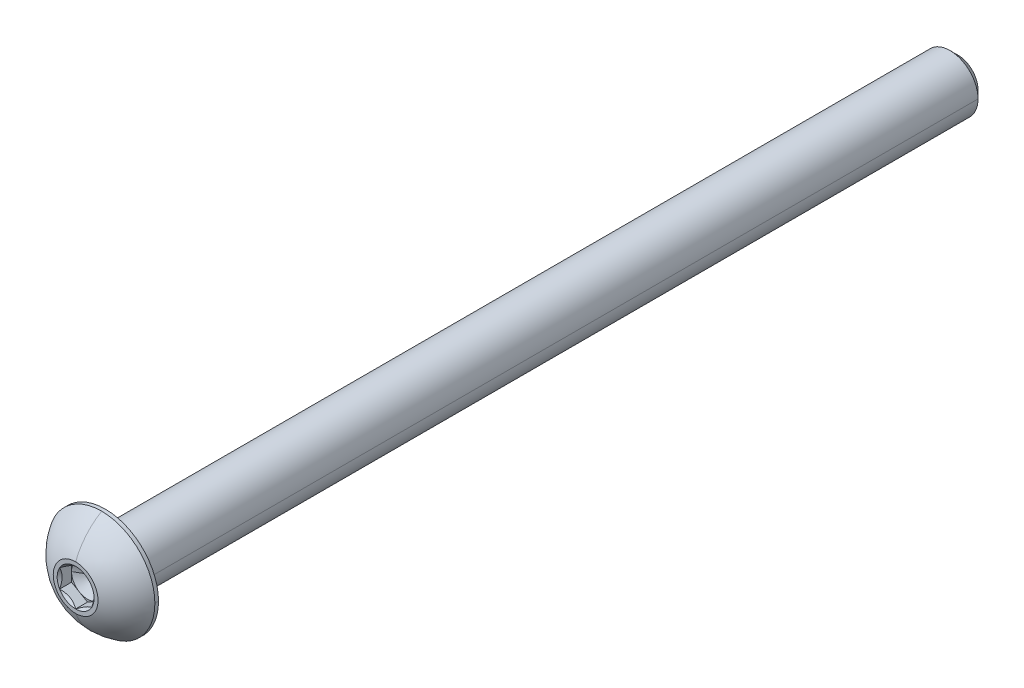
ISO-10303-21;
HEADER;
FILE_DESCRIPTION(('STEP AP214'),'2;1');
FILE_NAME('part.step','',(''),(''),'','','');
FILE_SCHEMA(('AUTOMOTIVE_DESIGN { 1 0 10303 214 1 1 1 1 }'));
ENDSEC;
DATA;
#1=APPLICATION_CONTEXT('core data for automotive mechanical design processes');
#2=APPLICATION_PROTOCOL_DEFINITION('international standard','automotive_design',2000,#1);
#3=PRODUCT_CONTEXT('',#1,'mechanical');
#4=PRODUCT('Part','Part','',(#3));
#5=PRODUCT_RELATED_PRODUCT_CATEGORY('part','',(#4));
#6=PRODUCT_DEFINITION_FORMATION('','',#4);
#7=PRODUCT_DEFINITION_CONTEXT('part definition',#1,'design');
#8=PRODUCT_DEFINITION('design','',#6,#7);
#9=PRODUCT_DEFINITION_SHAPE('','',#8);
#10=(LENGTH_UNIT() NAMED_UNIT(*) SI_UNIT(.MILLI.,.METRE.));
#11=(NAMED_UNIT(*) PLANE_ANGLE_UNIT() SI_UNIT($,.RADIAN.));
#12=(NAMED_UNIT(*) SI_UNIT($,.STERADIAN.) SOLID_ANGLE_UNIT());
#13=UNCERTAINTY_MEASURE_WITH_UNIT(LENGTH_MEASURE(1.E-05),#10,'distance_accuracy_value','');
#14=(GEOMETRIC_REPRESENTATION_CONTEXT(3) GLOBAL_UNCERTAINTY_ASSIGNED_CONTEXT((#13)) GLOBAL_UNIT_ASSIGNED_CONTEXT((#10,
#11,#12)) REPRESENTATION_CONTEXT('',''));
#15=CARTESIAN_POINT('',(0.,0.,0.));
#16=DIRECTION('',(0.,0.,1.));
#17=DIRECTION('',(1.,0.,0.));
#18=AXIS2_PLACEMENT_3D('',#15,#16,#17);
#19=CARTESIAN_POINT('',(0.,0.,32.8549));
#20=DIRECTION('',(0.,0.,1.));
#21=DIRECTION('',(1.,0.,0.));
#22=AXIS2_PLACEMENT_3D('',#19,#20,#21);
#23=CONICAL_SURFACE('',#22,1.3748153285078,0.78539816339745);
#24=CARTESIAN_POINT('',(0.,0.,32.8549));
#25=DIRECTION('',(0.,0.,1.));
#26=DIRECTION('',(1.,0.,0.));
#27=AXIS2_PLACEMENT_3D('',#24,#25,#26);
#28=CIRCLE('',#27,1.3748153285078);
#29=CARTESIAN_POINT('',(1.190625,0.687407664253897,32.8549));
#30=VERTEX_POINT('',#29);
#31=CARTESIAN_POINT('',(0.,1.3748153285078,32.8549));
#32=VERTEX_POINT('',#31);
#33=EDGE_CURVE('E444',#30,#32,#28,.T.);
#34=ORIENTED_EDGE('',*,*,#33,.T.);
#35=CARTESIAN_POINT('',(1.190625,0.687407664253899,32.8549));
#36=CARTESIAN_POINT('',(0.873024114796924,0.870774620820758,32.6715330434332));
#37=CARTESIAN_POINT('',(0.597505961514452,1.02984510078502,32.6707123654655));
#38=CARTESIAN_POINT('',(0.320451722064789,1.18980244051141,32.6698871120023));
#39=CARTESIAN_POINT('',(0.,1.3748153285078,32.8549));
#40=B_SPLINE_CURVE_WITH_KNOTS('',2,(#35,#36,#37,#38,#39),.UNSPECIFIED.,.F.,.F.,(3,2,3),(0.,0.5,
1.),.UNSPECIFIED.);
#41=EDGE_CURVE('E532',#30,#32,#40,.T.);
#42=ORIENTED_EDGE('',*,*,#41,.F.);
#43=EDGE_LOOP('',(#34,#42));
#44=FACE_BOUND('',#43,.T.);
#45=ADVANCED_FACE('F16',(#44),#23,.F.);
#46=CARTESIAN_POINT('',(0.,0.,32.8549));
#47=DIRECTION('',(0.,0.,1.));
#48=DIRECTION('',(1.,0.,0.));
#49=AXIS2_PLACEMENT_3D('',#46,#47,#48);
#50=CONICAL_SURFACE('',#49,1.3748153285078,0.78539816339745);
#51=DIRECTION('',(0.707106781186549,0.,0.707106781186546));
#52=VECTOR('',#51,1.);
#53=CARTESIAN_POINT('',(1.3748153285078,0.,32.8549));
#54=LINE('',#53,#52);
#55=CARTESIAN_POINT('',(1.190625,0.,32.6707096714922));
#56=VERTEX_POINT('',#55);
#57=CARTESIAN_POINT('',(1.3748153285078,0.,32.8549));
#58=VERTEX_POINT('',#57);
#59=EDGE_CURVE('E312',#56,#58,#54,.T.);
#60=ORIENTED_EDGE('',*,*,#59,.F.);
#61=CARTESIAN_POINT('',(1.190625,-0.687407664253897,32.8549));
#62=CARTESIAN_POINT('',(1.190625,-0.513285358669951,32.767838847208));
#63=CARTESIAN_POINT('',(1.190625,-0.353905765803971,32.7221946431507));
#64=CARTESIAN_POINT('',(1.190625,-0.174131487971274,32.6707096714922));
#65=CARTESIAN_POINT('',(1.190625,0.,32.6707096714922));
#66=B_SPLINE_CURVE_WITH_KNOTS('',2,(#61,#62,#63,#64,#65),.UNSPECIFIED.,.F.,.F.,(3,2,3),(0.,0.5,
1.),.UNSPECIFIED.);
#67=CARTESIAN_POINT('',(1.190625,-0.687407664253897,32.8549));
#68=VERTEX_POINT('',#67);
#69=EDGE_CURVE('E247',#68,#56,#66,.T.);
#70=ORIENTED_EDGE('',*,*,#69,.F.);
#71=CARTESIAN_POINT('',(0.,0.,32.8549));
#72=DIRECTION('',(0.,0.,1.));
#73=DIRECTION('',(1.,0.,0.));
#74=AXIS2_PLACEMENT_3D('',#71,#72,#73);
#75=CIRCLE('',#74,1.3748153285078);
#76=EDGE_CURVE('E437',#68,#58,#75,.T.);
#77=ORIENTED_EDGE('',*,*,#76,.T.);
#78=EDGE_LOOP('',(#60,#70,#77));
#79=FACE_BOUND('',#78,.T.);
#80=ADVANCED_FACE('F292',(#79),#50,.F.);
#81=CARTESIAN_POINT('',(0.,0.,32.8549));
#82=DIRECTION('',(0.,0.,1.));
#83=DIRECTION('',(1.,0.,0.));
#84=AXIS2_PLACEMENT_3D('',#81,#82,#83);
#85=CONICAL_SURFACE('',#84,1.3748153285078,0.78539816339745);
#86=CARTESIAN_POINT('',(0.,0.,32.8549));
#87=DIRECTION('',(0.,0.,1.));
#88=DIRECTION('',(1.,0.,0.));
#89=AXIS2_PLACEMENT_3D('',#86,#87,#88);
#90=CIRCLE('',#89,1.3748153285078);
#91=CARTESIAN_POINT('',(0.,-1.3748153285078,32.8549));
#92=VERTEX_POINT('',#91);
#93=EDGE_CURVE('E426',#92,#68,#90,.T.);
#94=ORIENTED_EDGE('',*,*,#93,.T.);
#95=CARTESIAN_POINT('',(0.,-1.3748153285078,32.8549));
#96=CARTESIAN_POINT('',(0.317600885191901,-1.19144837194739,32.6715330434396));
#97=CARTESIAN_POINT('',(0.593119038485549,-1.03237789197667,32.6707123654655));
#98=CARTESIAN_POINT('',(0.870173277923972,-0.872420552256772,32.6698871119958));
#99=CARTESIAN_POINT('',(1.190625,-0.687407664253898,32.8549));
#100=B_SPLINE_CURVE_WITH_KNOTS('',2,(#95,#96,#97,#98,#99),.UNSPECIFIED.,.F.,.F.,(3,2,3),(0.,0.5,
1.),.UNSPECIFIED.);
#101=EDGE_CURVE('E238',#92,#68,#100,.T.);
#102=ORIENTED_EDGE('',*,*,#101,.F.);
#103=EDGE_LOOP('',(#94,#102));
#104=FACE_BOUND('',#103,.T.);
#105=ADVANCED_FACE('F402',(#104),#85,.F.);
#106=CARTESIAN_POINT('',(0.,0.,32.8549));
#107=DIRECTION('',(0.,0.,1.));
#108=DIRECTION('',(1.,0.,0.));
#109=AXIS2_PLACEMENT_3D('',#106,#107,#108);
#110=CONICAL_SURFACE('',#109,1.3748153285078,0.78539816339745);
#111=CARTESIAN_POINT('',(0.,0.,32.8549));
#112=DIRECTION('',(0.,0.,1.));
#113=DIRECTION('',(1.,0.,0.));
#114=AXIS2_PLACEMENT_3D('',#111,#112,#113);
#115=CIRCLE('',#114,1.3748153285078);
#116=CARTESIAN_POINT('',(-1.190625,-0.6874076642539,32.8549));
#117=VERTEX_POINT('',#116);
#118=EDGE_CURVE('E424',#117,#92,#115,.T.);
#119=ORIENTED_EDGE('',*,*,#118,.T.);
#120=CARTESIAN_POINT('',(-1.190625,-0.6874076642539,32.8549));
#121=CARTESIAN_POINT('',(-0.87302411480077,-0.870774620818538,32.6715330434353));
#122=CARTESIAN_POINT('',(-0.597505961514451,-1.02984510078502,32.6707123654655));
#123=CARTESIAN_POINT('',(-0.320451722068542,-1.18980244050924,32.6698871120002));
#124=CARTESIAN_POINT('',(0.,-1.3748153285078,32.8549));
#125=B_SPLINE_CURVE_WITH_KNOTS('',2,(#120,#121,#122,#123,#124),.UNSPECIFIED.,.F.,.F.,(3,2,3),
(0.,0.5,1.),.UNSPECIFIED.);
#126=EDGE_CURVE('E383',#117,#92,#125,.T.);
#127=ORIENTED_EDGE('',*,*,#126,.F.);
#128=EDGE_LOOP('',(#119,#127));
#129=FACE_BOUND('',#128,.T.);
#130=ADVANCED_FACE('F391',(#129),#110,.F.);
#131=CARTESIAN_POINT('',(0.,0.,32.8549));
#132=DIRECTION('',(0.,0.,1.));
#133=DIRECTION('',(1.,0.,0.));
#134=AXIS2_PLACEMENT_3D('',#131,#132,#133);
#135=CONICAL_SURFACE('',#134,1.3748153285078,0.78539816339745);
#136=CARTESIAN_POINT('',(0.,0.,32.8549));
#137=DIRECTION('',(0.,0.,1.));
#138=DIRECTION('',(1.,0.,0.));
#139=AXIS2_PLACEMENT_3D('',#136,#137,#138);
#140=CIRCLE('',#139,1.3748153285078);
#141=CARTESIAN_POINT('',(-1.190625,0.687407664253897,32.8549));
#142=VERTEX_POINT('',#141);
#143=EDGE_CURVE('E261',#142,#117,#140,.T.);
#144=ORIENTED_EDGE('',*,*,#143,.T.);
#145=CARTESIAN_POINT('',(-1.190625,0.687407664253897,32.8549));
#146=CARTESIAN_POINT('',(-1.190625,0.512542074756485,32.7674672052513));
#147=CARTESIAN_POINT('',(-1.190625,0.354007376669906,32.7222235982477));
#148=CARTESIAN_POINT('',(-1.190625,0.17371570732276,32.6707708529976));
#149=CARTESIAN_POINT('',(-1.190625,-0.000136673000707003,32.6707096793366));
#150=CARTESIAN_POINT('',(-1.190625,-0.17277776285971,32.670648931894));
#151=CARTESIAN_POINT('',(-1.190625,-0.353970621561858,32.722213123607));
#152=CARTESIAN_POINT('',(-1.190625,-0.51195006134082,32.7671711985435));
#153=CARTESIAN_POINT('',(-1.190625,-0.6874076642539,32.8549));
#154=B_SPLINE_CURVE_WITH_KNOTS('',2,(#145,#146,#147,#148,#149,#150,#151,#152,#153),
.UNSPECIFIED.,.F.,.F.,(3,2,2,2,3),(0.,0.25,0.5,0.75,1.),.UNSPECIFIED.);
#155=EDGE_CURVE('E230',#142,#117,#154,.T.);
#156=ORIENTED_EDGE('',*,*,#155,.F.);
#157=EDGE_LOOP('',(#144,#156));
#158=FACE_BOUND('',#157,.T.);
#159=ADVANCED_FACE('F401',(#158),#135,.F.);
#160=CARTESIAN_POINT('',(0.,0.,32.8549));
#161=DIRECTION('',(0.,0.,1.));
#162=DIRECTION('',(1.,0.,0.));
#163=AXIS2_PLACEMENT_3D('',#160,#161,#162);
#164=CONICAL_SURFACE('',#163,1.3748153285078,0.78539816339745);
#165=CARTESIAN_POINT('',(0.,0.,32.8549));
#166=DIRECTION('',(0.,0.,1.));
#167=DIRECTION('',(1.,0.,0.));
#168=AXIS2_PLACEMENT_3D('',#165,#166,#167);
#169=CIRCLE('',#168,1.3748153285078);
#170=EDGE_CURVE('E521',#32,#142,#169,.T.);
#171=ORIENTED_EDGE('',*,*,#170,.T.);
#172=CARTESIAN_POINT('',(0.,1.3748153285078,32.8549));
#173=CARTESIAN_POINT('',(-0.317600885199246,1.19144837194315,32.6715330434353));
#174=CARTESIAN_POINT('',(-0.593119038485549,1.03237789197667,32.6707123654655));
#175=CARTESIAN_POINT('',(-0.870173277931471,0.872420552252443,32.6698871120002));
#176=CARTESIAN_POINT('',(-1.190625,0.687407664253898,32.8549));
#177=B_SPLINE_CURVE_WITH_KNOTS('',2,(#172,#173,#174,#175,#176),.UNSPECIFIED.,.F.,.F.,(3,2,3),
(0.,0.5,1.),.UNSPECIFIED.);
#178=EDGE_CURVE('E496',#32,#142,#177,.T.);
#179=ORIENTED_EDGE('',*,*,#178,.F.);
#180=EDGE_LOOP('',(#171,#179));
#181=FACE_BOUND('',#180,.T.);
#182=ADVANCED_FACE('F846',(#181),#164,.F.);
#183=CARTESIAN_POINT('',(0.,0.,31.97098));
#184=DIRECTION('',(0.,0.,1.));
#185=DIRECTION('',(1.,0.,0.));
#186=AXIS2_PLACEMENT_3D('',#183,#184,#185);
#187=CONICAL_SURFACE('',#186,1.190625,1.0471975511966);
#188=DIRECTION('',(-0.866025403784439,0.,0.5));
#189=VECTOR('',#188,1.);
#190=CARTESIAN_POINT('',(-1.190625,0.,31.97098));
#191=LINE('',#190,#189);
#192=CARTESIAN_POINT('',(0.,0.,31.2835723357461));
#193=VERTEX_POINT('',#192);
#194=CARTESIAN_POINT('',(-1.190625,0.,31.97098));
#195=VERTEX_POINT('',#194);
#196=EDGE_CURVE('E206',#193,#195,#191,.T.);
#197=ORIENTED_EDGE('',*,*,#196,.F.);
#198=DIRECTION('',(0.866025403784439,0.,0.5));
#199=VECTOR('',#198,1.);
#200=CARTESIAN_POINT('',(1.190625,0.,31.97098));
#201=LINE('',#200,#199);
#202=CARTESIAN_POINT('',(1.190625,0.,31.97098));
#203=VERTEX_POINT('',#202);
#204=EDGE_CURVE('E203',#193,#203,#201,.T.);
#205=ORIENTED_EDGE('',*,*,#204,.T.);
#206=CARTESIAN_POINT('',(0.,0.,31.97098));
#207=DIRECTION('',(0.,0.,1.));
#208=DIRECTION('',(1.,0.,0.));
#209=AXIS2_PLACEMENT_3D('',#206,#207,#208);
#210=CIRCLE('',#209,1.190625);
#211=CARTESIAN_POINT('',(0.5953125,1.03111149638085,31.97098));
#212=VERTEX_POINT('',#211);
#213=EDGE_CURVE('E11',#203,#212,#210,.T.);
#214=ORIENTED_EDGE('',*,*,#213,.T.);
#215=CARTESIAN_POINT('',(0.,0.,31.97098));
#216=DIRECTION('',(0.,0.,1.));
#217=DIRECTION('',(1.,0.,0.));
#218=AXIS2_PLACEMENT_3D('',#215,#216,#217);
#219=CIRCLE('',#218,1.190625);
#220=CARTESIAN_POINT('',(-0.5953125,1.03111149638085,31.97098));
#221=VERTEX_POINT('',#220);
#222=EDGE_CURVE('E30',#212,#221,#219,.T.);
#223=ORIENTED_EDGE('',*,*,#222,.T.);
#224=CARTESIAN_POINT('',(0.,0.,31.97098));
#225=DIRECTION('',(0.,0.,1.));
#226=DIRECTION('',(1.,0.,0.));
#227=AXIS2_PLACEMENT_3D('',#224,#225,#226);
#228=CIRCLE('',#227,1.190625);
#229=EDGE_CURVE('E65',#221,#195,#228,.T.);
#230=ORIENTED_EDGE('',*,*,#229,.T.);
#231=EDGE_LOOP('',(#197,#205,#214,#223,#230));
#232=FACE_BOUND('',#231,.T.);
#233=ADVANCED_FACE('F852',(#232),#187,.F.);
#234=CARTESIAN_POINT('',(0.,0.,31.97098));
#235=DIRECTION('',(0.,0.,1.));
#236=DIRECTION('',(1.,0.,0.));
#237=AXIS2_PLACEMENT_3D('',#234,#235,#236);
#238=PLANE('',#237);
#239=ORIENTED_EDGE('',*,*,#213,.F.);
#240=DIRECTION('',(0.,1.,0.));
#241=VECTOR('',#240,1.);
#242=CARTESIAN_POINT('',(1.190625,-0.687407664253898,31.97098));
#243=LINE('',#242,#241);
#244=CARTESIAN_POINT('',(1.190625,0.687407664253899,31.97098));
#245=VERTEX_POINT('',#244);
#246=EDGE_CURVE('E202',#203,#245,#243,.T.);
#247=ORIENTED_EDGE('',*,*,#246,.T.);
#248=DIRECTION('',(-0.866025403784439,0.5,0.));
#249=VECTOR('',#248,1.);
#250=CARTESIAN_POINT('',(1.190625,0.687407664253899,31.97098));
#251=LINE('',#250,#249);
#252=EDGE_CURVE('E267',#245,#212,#251,.T.);
#253=ORIENTED_EDGE('',*,*,#252,.T.);
#254=EDGE_LOOP('',(#239,#247,#253));
#255=FACE_BOUND('',#254,.T.);
#256=ADVANCED_FACE('F796',(#255),#238,.T.);
#257=CARTESIAN_POINT('',(0.,0.,31.97098));
#258=DIRECTION('',(0.,0.,1.));
#259=DIRECTION('',(1.,0.,0.));
#260=AXIS2_PLACEMENT_3D('',#257,#258,#259);
#261=PLANE('',#260);
#262=ORIENTED_EDGE('',*,*,#222,.F.);
#263=DIRECTION('',(-0.866025403784439,0.5,0.));
#264=VECTOR('',#263,1.);
#265=CARTESIAN_POINT('',(1.190625,0.687407664253899,31.97098));
#266=LINE('',#265,#264);
#267=CARTESIAN_POINT('',(0.,1.3748153285078,31.97098));
#268=VERTEX_POINT('',#267);
#269=EDGE_CURVE('E263',#212,#268,#266,.T.);
#270=ORIENTED_EDGE('',*,*,#269,.T.);
#271=DIRECTION('',(-0.866025403784438,-0.5,0.));
#272=VECTOR('',#271,1.);
#273=CARTESIAN_POINT('',(0.,1.3748153285078,31.97098));
#274=LINE('',#273,#272);
#275=EDGE_CURVE('E226',#268,#221,#274,.T.);
#276=ORIENTED_EDGE('',*,*,#275,.T.);
#277=EDGE_LOOP('',(#262,#270,#276));
#278=FACE_BOUND('',#277,.T.);
#279=ADVANCED_FACE('F792',(#278),#261,.T.);
#280=CARTESIAN_POINT('',(0.,0.,31.97098));
#281=DIRECTION('',(0.,0.,1.));
#282=DIRECTION('',(1.,0.,0.));
#283=AXIS2_PLACEMENT_3D('',#280,#281,#282);
#284=PLANE('',#283);
#285=ORIENTED_EDGE('',*,*,#229,.F.);
#286=DIRECTION('',(-0.866025403784438,-0.5,0.));
#287=VECTOR('',#286,1.);
#288=CARTESIAN_POINT('',(0.,1.3748153285078,31.97098));
#289=LINE('',#288,#287);
#290=CARTESIAN_POINT('',(-1.190625,0.687407664253898,31.97098));
#291=VERTEX_POINT('',#290);
#292=EDGE_CURVE('E231',#221,#291,#289,.T.);
#293=ORIENTED_EDGE('',*,*,#292,.T.);
#294=DIRECTION('',(0.,-1.,0.));
#295=VECTOR('',#294,1.);
#296=CARTESIAN_POINT('',(-1.190625,0.687407664253898,31.97098));
#297=LINE('',#296,#295);
#298=EDGE_CURVE('E469',#291,#195,#297,.T.);
#299=ORIENTED_EDGE('',*,*,#298,.T.);
#300=EDGE_LOOP('',(#285,#293,#299));
#301=FACE_BOUND('',#300,.T.);
#302=ADVANCED_FACE('F356',(#301),#284,.T.);
#303=CARTESIAN_POINT('',(0.,0.,31.97098));
#304=DIRECTION('',(0.,0.,1.));
#305=DIRECTION('',(1.,0.,0.));
#306=AXIS2_PLACEMENT_3D('',#303,#304,#305);
#307=PLANE('',#306);
#308=CARTESIAN_POINT('',(0.,0.,31.97098));
#309=DIRECTION('',(0.,0.,1.));
#310=DIRECTION('',(1.,0.,0.));
#311=AXIS2_PLACEMENT_3D('',#308,#309,#310);
#312=CIRCLE('',#311,1.190625);
#313=CARTESIAN_POINT('',(-0.5953125,-1.03111149638085,31.97098));
#314=VERTEX_POINT('',#313);
#315=EDGE_CURVE('E208',#195,#314,#312,.T.);
#316=ORIENTED_EDGE('',*,*,#315,.F.);
#317=DIRECTION('',(0.,-1.,0.));
#318=VECTOR('',#317,1.);
#319=CARTESIAN_POINT('',(-1.190625,0.687407664253898,31.97098));
#320=LINE('',#319,#318);
#321=CARTESIAN_POINT('',(-1.190625,-0.687407664253899,31.97098));
#322=VERTEX_POINT('',#321);
#323=EDGE_CURVE('E472',#195,#322,#320,.T.);
#324=ORIENTED_EDGE('',*,*,#323,.T.);
#325=DIRECTION('',(0.866025403784439,-0.5,0.));
#326=VECTOR('',#325,1.);
#327=CARTESIAN_POINT('',(-1.190625,-0.687407664253899,31.97098));
#328=LINE('',#327,#326);
#329=EDGE_CURVE('E235',#322,#314,#328,.T.);
#330=ORIENTED_EDGE('',*,*,#329,.T.);
#331=EDGE_LOOP('',(#316,#324,#330));
#332=FACE_BOUND('',#331,.T.);
#333=ADVANCED_FACE('F366',(#332),#307,.T.);
#334=CARTESIAN_POINT('',(0.,0.,31.97098));
#335=DIRECTION('',(0.,0.,1.));
#336=DIRECTION('',(1.,0.,0.));
#337=AXIS2_PLACEMENT_3D('',#334,#335,#336);
#338=PLANE('',#337);
#339=CARTESIAN_POINT('',(0.,0.,31.97098));
#340=DIRECTION('',(0.,0.,1.));
#341=DIRECTION('',(1.,0.,0.));
#342=AXIS2_PLACEMENT_3D('',#339,#340,#341);
#343=CIRCLE('',#342,1.190625);
#344=CARTESIAN_POINT('',(0.5953125,-1.03111149638085,31.97098));
#345=VERTEX_POINT('',#344);
#346=EDGE_CURVE('E198',#314,#345,#343,.T.);
#347=ORIENTED_EDGE('',*,*,#346,.F.);
#348=DIRECTION('',(0.866025403784439,-0.5,0.));
#349=VECTOR('',#348,1.);
#350=CARTESIAN_POINT('',(-1.190625,-0.687407664253899,31.97098));
#351=LINE('',#350,#349);
#352=CARTESIAN_POINT('',(0.,-1.3748153285078,31.97098));
#353=VERTEX_POINT('',#352);
#354=EDGE_CURVE('E239',#314,#353,#351,.T.);
#355=ORIENTED_EDGE('',*,*,#354,.T.);
#356=DIRECTION('',(0.866025403784439,0.5,0.));
#357=VECTOR('',#356,1.);
#358=CARTESIAN_POINT('',(0.,-1.3748153285078,31.97098));
#359=LINE('',#358,#357);
#360=EDGE_CURVE('E243',#353,#345,#359,.T.);
#361=ORIENTED_EDGE('',*,*,#360,.T.);
#362=EDGE_LOOP('',(#347,#355,#361));
#363=FACE_BOUND('',#362,.T.);
#364=ADVANCED_FACE('F290',(#363),#338,.T.);
#365=CARTESIAN_POINT('',(0.,0.,31.97098));
#366=DIRECTION('',(0.,0.,1.));
#367=DIRECTION('',(1.,0.,0.));
#368=AXIS2_PLACEMENT_3D('',#365,#366,#367);
#369=PLANE('',#368);
#370=CARTESIAN_POINT('',(0.,0.,31.97098));
#371=DIRECTION('',(0.,0.,1.));
#372=DIRECTION('',(1.,0.,0.));
#373=AXIS2_PLACEMENT_3D('',#370,#371,#372);
#374=CIRCLE('',#373,1.190625);
#375=EDGE_CURVE('E187',#345,#203,#374,.T.);
#376=ORIENTED_EDGE('',*,*,#375,.F.);
#377=DIRECTION('',(0.866025403784439,0.5,0.));
#378=VECTOR('',#377,1.);
#379=CARTESIAN_POINT('',(0.,-1.3748153285078,31.97098));
#380=LINE('',#379,#378);
#381=CARTESIAN_POINT('',(1.190625,-0.687407664253898,31.97098));
#382=VERTEX_POINT('',#381);
#383=EDGE_CURVE('E240',#345,#382,#380,.T.);
#384=ORIENTED_EDGE('',*,*,#383,.T.);
#385=DIRECTION('',(0.,1.,0.));
#386=VECTOR('',#385,1.);
#387=CARTESIAN_POINT('',(1.190625,-0.687407664253898,31.97098));
#388=LINE('',#387,#386);
#389=EDGE_CURVE('E45',#382,#203,#388,.T.);
#390=ORIENTED_EDGE('',*,*,#389,.T.);
#391=EDGE_LOOP('',(#376,#384,#390));
#392=FACE_BOUND('',#391,.T.);
#393=ADVANCED_FACE('F289',(#392),#369,.T.);
#394=CARTESIAN_POINT('',(1.190625,-0.687407664253898,32.8549));
#395=DIRECTION('',(-1.,0.,0.));
#396=DIRECTION('',(0.,1.,0.));
#397=AXIS2_PLACEMENT_3D('',#394,#395,#396);
#398=PLANE('',#397);
#399=ORIENTED_EDGE('',*,*,#69,.T.);
#400=CARTESIAN_POINT('',(1.190625,0.,32.6707096714922));
#401=CARTESIAN_POINT('',(1.190625,0.172347256927115,32.6707096714922));
#402=CARTESIAN_POINT('',(1.190625,0.354072322932422,32.7222421093766));
#403=CARTESIAN_POINT('',(1.190625,0.511214824203054,32.7668035799746));
#404=CARTESIAN_POINT('',(1.190625,0.687407664253896,32.8549));
#405=B_SPLINE_CURVE_WITH_KNOTS('',2,(#400,#401,#402,#403,#404),.UNSPECIFIED.,.F.,.F.,(3,2,3),
(0.,0.5,1.),.UNSPECIFIED.);
#406=EDGE_CURVE('E310',#56,#30,#405,.T.);
#407=ORIENTED_EDGE('',*,*,#406,.T.);
#408=DIRECTION('',(0.,0.,-1.));
#409=VECTOR('',#408,1.);
#410=CARTESIAN_POINT('',(1.190625,0.687407664253899,32.8549));
#411=LINE('',#410,#409);
#412=EDGE_CURVE('E485',#30,#245,#411,.T.);
#413=ORIENTED_EDGE('',*,*,#412,.T.);
#414=ORIENTED_EDGE('',*,*,#246,.F.);
#415=ORIENTED_EDGE('',*,*,#389,.F.);
#416=DIRECTION('',(0.,0.,-1.));
#417=VECTOR('',#416,1.);
#418=CARTESIAN_POINT('',(1.190625,-0.687407664253898,32.8549));
#419=LINE('',#418,#417);
#420=EDGE_CURVE('E244',#68,#382,#419,.T.);
#421=ORIENTED_EDGE('',*,*,#420,.F.);
#422=EDGE_LOOP('',(#399,#407,#413,#414,#415,#421));
#423=FACE_BOUND('',#422,.T.);
#424=ADVANCED_FACE('F278',(#423),#398,.T.);
#425=CARTESIAN_POINT('',(0.,-1.3748153285078,32.8549));
#426=DIRECTION('',(-0.5,0.866025403784438,0.));
#427=DIRECTION('',(0.,0.,1.));
#428=AXIS2_PLACEMENT_3D('',#425,#426,#427);
#429=PLANE('',#428);
#430=ORIENTED_EDGE('',*,*,#101,.T.);
#431=ORIENTED_EDGE('',*,*,#420,.T.);
#432=ORIENTED_EDGE('',*,*,#383,.F.);
#433=ORIENTED_EDGE('',*,*,#360,.F.);
#434=DIRECTION('',(0.,0.,-1.));
#435=VECTOR('',#434,1.);
#436=CARTESIAN_POINT('',(0.,-1.3748153285078,32.8549));
#437=LINE('',#436,#435);
#438=EDGE_CURVE('E413',#92,#353,#437,.T.);
#439=ORIENTED_EDGE('',*,*,#438,.F.);
#440=EDGE_LOOP('',(#430,#431,#432,#433,#439));
#441=FACE_BOUND('',#440,.T.);
#442=ADVANCED_FACE('F288',(#441),#429,.T.);
#443=CARTESIAN_POINT('',(-1.190625,-0.687407664253899,32.8549));
#444=DIRECTION('',(0.5,0.866025403784439,0.));
#445=DIRECTION('',(0.,0.,-1.));
#446=AXIS2_PLACEMENT_3D('',#443,#444,#445);
#447=PLANE('',#446);
#448=ORIENTED_EDGE('',*,*,#126,.T.);
#449=ORIENTED_EDGE('',*,*,#438,.T.);
#450=ORIENTED_EDGE('',*,*,#354,.F.);
#451=ORIENTED_EDGE('',*,*,#329,.F.);
#452=DIRECTION('',(0.,0.,-1.));
#453=VECTOR('',#452,1.);
#454=CARTESIAN_POINT('',(-1.190625,-0.687407664253899,32.8549));
#455=LINE('',#454,#453);
#456=EDGE_CURVE('E389',#117,#322,#455,.T.);
#457=ORIENTED_EDGE('',*,*,#456,.F.);
#458=EDGE_LOOP('',(#448,#449,#450,#451,#457));
#459=FACE_BOUND('',#458,.T.);
#460=ADVANCED_FACE('F355',(#459),#447,.T.);
#461=CARTESIAN_POINT('',(-1.190625,0.687407664253898,32.8549));
#462=DIRECTION('',(1.,0.,0.));
#463=DIRECTION('',(0.,1.,0.));
#464=AXIS2_PLACEMENT_3D('',#461,#462,#463);
#465=PLANE('',#464);
#466=ORIENTED_EDGE('',*,*,#155,.T.);
#467=ORIENTED_EDGE('',*,*,#456,.T.);
#468=ORIENTED_EDGE('',*,*,#323,.F.);
#469=ORIENTED_EDGE('',*,*,#298,.F.);
#470=DIRECTION('',(0.,0.,-1.));
#471=VECTOR('',#470,1.);
#472=CARTESIAN_POINT('',(-1.190625,0.687407664253898,32.8549));
#473=LINE('',#472,#471);
#474=EDGE_CURVE('E493',#142,#291,#473,.T.);
#475=ORIENTED_EDGE('',*,*,#474,.F.);
#476=EDGE_LOOP('',(#466,#467,#468,#469,#475));
#477=FACE_BOUND('',#476,.T.);
#478=ADVANCED_FACE('F18',(#477),#465,.T.);
#479=CARTESIAN_POINT('',(0.,1.3748153285078,32.8549));
#480=DIRECTION('',(0.5,-0.866025403784439,0.));
#481=DIRECTION('',(0.,0.,-1.));
#482=AXIS2_PLACEMENT_3D('',#479,#480,#481);
#483=PLANE('',#482);
#484=ORIENTED_EDGE('',*,*,#178,.T.);
#485=ORIENTED_EDGE('',*,*,#474,.T.);
#486=ORIENTED_EDGE('',*,*,#292,.F.);
#487=ORIENTED_EDGE('',*,*,#275,.F.);
#488=DIRECTION('',(0.,0.,-1.));
#489=VECTOR('',#488,1.);
#490=CARTESIAN_POINT('',(0.,1.3748153285078,32.8549));
#491=LINE('',#490,#489);
#492=EDGE_CURVE('E268',#32,#268,#491,.T.);
#493=ORIENTED_EDGE('',*,*,#492,.F.);
#494=EDGE_LOOP('',(#484,#485,#486,#487,#493));
#495=FACE_BOUND('',#494,.T.);
#496=ADVANCED_FACE('F763',(#495),#483,.T.);
#497=CARTESIAN_POINT('',(1.190625,0.687407664253899,32.8549));
#498=DIRECTION('',(-0.5,-0.866025403784439,0.));
#499=DIRECTION('',(-0.866025403784439,0.5,0.));
#500=AXIS2_PLACEMENT_3D('',#497,#498,#499);
#501=PLANE('',#500);
#502=ORIENTED_EDGE('',*,*,#41,.T.);
#503=ORIENTED_EDGE('',*,*,#492,.T.);
#504=ORIENTED_EDGE('',*,*,#269,.F.);
#505=ORIENTED_EDGE('',*,*,#252,.F.);
#506=ORIENTED_EDGE('',*,*,#412,.F.);
#507=EDGE_LOOP('',(#502,#503,#504,#505,#506));
#508=FACE_BOUND('',#507,.T.);
#509=ADVANCED_FACE('F754',(#508),#501,.T.);
#510=CARTESIAN_POINT('',(0.,1.4874875,-32.8549));
#511=DIRECTION('',(0.,0.,1.));
#512=DIRECTION('',(1.,0.,0.));
#513=AXIS2_PLACEMENT_3D('',#510,#511,#512);
#514=PLANE('',#513);
#515=CARTESIAN_POINT('',(0.,0.,-32.8549));
#516=DIRECTION('',(0.,0.,1.));
#517=DIRECTION('',(1.,0.,0.));
#518=AXIS2_PLACEMENT_3D('',#515,#516,#517);
#519=CIRCLE('',#518,1.4874875);
#520=CARTESIAN_POINT('',(1.4874875,0.,-32.8549));
#521=VERTEX_POINT('',#520);
#522=CARTESIAN_POINT('',(-1.4874875,0.,-32.8549));
#523=VERTEX_POINT('',#522);
#524=EDGE_CURVE('E216',#521,#523,#519,.T.);
#525=ORIENTED_EDGE('',*,*,#524,.F.);
#526=CARTESIAN_POINT('',(0.,0.,-32.8549));
#527=DIRECTION('',(0.,0.,1.));
#528=DIRECTION('',(1.,0.,0.));
#529=AXIS2_PLACEMENT_3D('',#526,#527,#528);
#530=CIRCLE('',#529,1.4874875);
#531=EDGE_CURVE('E259',#523,#521,#530,.T.);
#532=ORIENTED_EDGE('',*,*,#531,.F.);
#533=EDGE_LOOP('',(#525,#532));
#534=FACE_BOUND('',#533,.T.);
#535=ADVANCED_FACE('F736',(#534),#514,.F.);
#536=CARTESIAN_POINT('',(0.,0.,28.5515956824338));
#537=DIRECTION('',(-1.,0.,0.));
#538=DIRECTION('',(0.,1.,0.));
#539=AXIS2_PLACEMENT_3D('',#536,#537,#538);
#540=SPHERICAL_SURFACE('',#539,4.61485647828933);
#541=CARTESIAN_POINT('',(0.,0.,28.5515956824338));
#542=DIRECTION('',(-1.,0.,0.));
#543=DIRECTION('',(0.,-1.,0.));
#544=AXIS2_PLACEMENT_3D('',#541,#542,#543);
#545=CIRCLE('',#544,4.61485647828933);
#546=CARTESIAN_POINT('',(0.,-3.9624,30.9172428571428));
#547=VERTEX_POINT('',#546);
#548=CARTESIAN_POINT('',(0.,-1.666875,32.8549));
#549=VERTEX_POINT('',#548);
#550=EDGE_CURVE('E186',#547,#549,#545,.T.);
#551=ORIENTED_EDGE('',*,*,#550,.F.);
#552=CARTESIAN_POINT('',(0.,0.,30.9172428571428));
#553=DIRECTION('',(0.,0.,1.));
#554=DIRECTION('',(1.,0.,0.));
#555=AXIS2_PLACEMENT_3D('',#552,#553,#554);
#556=CIRCLE('',#555,3.9624);
#557=CARTESIAN_POINT('',(3.9624,0.,30.9172428571428));
#558=VERTEX_POINT('',#557);
#559=EDGE_CURVE('E183',#547,#558,#556,.T.);
#560=ORIENTED_EDGE('',*,*,#559,.T.);
#561=CARTESIAN_POINT('',(0.,0.,30.9172428571428));
#562=DIRECTION('',(0.,0.,1.));
#563=DIRECTION('',(1.,0.,0.));
#564=AXIS2_PLACEMENT_3D('',#561,#562,#563);
#565=CIRCLE('',#564,3.9624);
#566=CARTESIAN_POINT('',(0.,3.9624,30.9172428571428));
#567=VERTEX_POINT('',#566);
#568=EDGE_CURVE('E169',#558,#567,#565,.T.);
#569=ORIENTED_EDGE('',*,*,#568,.T.);
#570=CARTESIAN_POINT('',(0.,0.,28.5515956824338));
#571=DIRECTION('',(1.,0.,0.));
#572=DIRECTION('',(0.,0.,-1.));
#573=AXIS2_PLACEMENT_3D('',#570,#571,#572);
#574=CIRCLE('',#573,4.61485647828933);
#575=CARTESIAN_POINT('',(0.,1.666875,32.8549));
#576=VERTEX_POINT('',#575);
#577=EDGE_CURVE('E178',#567,#576,#574,.T.);
#578=ORIENTED_EDGE('',*,*,#577,.T.);
#579=CARTESIAN_POINT('',(0.,0.,32.8549));
#580=DIRECTION('',(0.,0.,1.));
#581=DIRECTION('',(1.,0.,0.));
#582=AXIS2_PLACEMENT_3D('',#579,#580,#581);
#583=CIRCLE('',#582,1.666875);
#584=EDGE_CURVE('E224',#549,#576,#583,.T.);
#585=ORIENTED_EDGE('',*,*,#584,.F.);
#586=EDGE_LOOP('',(#551,#560,#569,#578,#585));
#587=FACE_BOUND('',#586,.T.);
#588=ADVANCED_FACE('F728',(#587),#540,.T.);
#589=CARTESIAN_POINT('',(0.,0.,32.8549));
#590=DIRECTION('',(0.,0.,1.));
#591=DIRECTION('',(1.,0.,0.));
#592=AXIS2_PLACEMENT_3D('',#589,#590,#591);
#593=CYLINDRICAL_SURFACE('',#592,3.9624);
#594=DIRECTION('',(0.,0.,1.));
#595=VECTOR('',#594,1.);
#596=CARTESIAN_POINT('',(-3.9624,0.,32.8549));
#597=LINE('',#596,#595);
#598=CARTESIAN_POINT('',(-3.9624,0.,30.6451));
#599=VERTEX_POINT('',#598);
#600=CARTESIAN_POINT('',(-3.9624,0.,30.9172428571428));
#601=VERTEX_POINT('',#600);
#602=EDGE_CURVE('E156',#599,#601,#597,.T.);
#603=ORIENTED_EDGE('',*,*,#602,.F.);
#604=CARTESIAN_POINT('',(0.,0.,30.6451));
#605=DIRECTION('',(0.,0.,1.));
#606=DIRECTION('',(1.,0.,0.));
#607=AXIS2_PLACEMENT_3D('',#604,#605,#606);
#608=CIRCLE('',#607,3.9624);
#609=CARTESIAN_POINT('',(3.9624,0.,30.6451));
#610=VERTEX_POINT('',#609);
#611=EDGE_CURVE('E255',#599,#610,#608,.T.);
#612=ORIENTED_EDGE('',*,*,#611,.T.);
#613=DIRECTION('',(0.,0.,1.));
#614=VECTOR('',#613,1.);
#615=CARTESIAN_POINT('',(3.9624,0.,32.8549));
#616=LINE('',#615,#614);
#617=EDGE_CURVE('E251',#610,#558,#616,.T.);
#618=ORIENTED_EDGE('',*,*,#617,.T.);
#619=ORIENTED_EDGE('',*,*,#559,.F.);
#620=CARTESIAN_POINT('',(0.,0.,30.9172428571428));
#621=DIRECTION('',(0.,0.,1.));
#622=DIRECTION('',(1.,0.,0.));
#623=AXIS2_PLACEMENT_3D('',#620,#621,#622);
#624=CIRCLE('',#623,3.9624);
#625=EDGE_CURVE('E175',#601,#547,#624,.T.);
#626=ORIENTED_EDGE('',*,*,#625,.F.);
#627=EDGE_LOOP('',(#603,#612,#618,#619,#626));
#628=FACE_BOUND('',#627,.T.);
#629=ADVANCED_FACE('F181',(#628),#593,.T.);
#630=CARTESIAN_POINT('',(0.,3.9624,30.6451));
#631=DIRECTION('',(0.,0.,1.));
#632=DIRECTION('',(1.,0.,0.));
#633=AXIS2_PLACEMENT_3D('',#630,#631,#632);
#634=PLANE('',#633);
#635=CARTESIAN_POINT('',(0.,0.,30.6451));
#636=DIRECTION('',(0.,0.,1.));
#637=DIRECTION('',(1.,0.,0.));
#638=AXIS2_PLACEMENT_3D('',#635,#636,#637);
#639=CIRCLE('',#638,2.0828);
#640=CARTESIAN_POINT('',(2.0828,0.,30.6451));
#641=VERTEX_POINT('',#640);
#642=CARTESIAN_POINT('',(-2.0828,0.,30.6451));
#643=VERTEX_POINT('',#642);
#644=EDGE_CURVE('E217',#641,#643,#639,.T.);
#645=ORIENTED_EDGE('',*,*,#644,.T.);
#646=CARTESIAN_POINT('',(0.,0.,30.6451));
#647=DIRECTION('',(0.,0.,1.));
#648=DIRECTION('',(1.,0.,0.));
#649=AXIS2_PLACEMENT_3D('',#646,#647,#648);
#650=CIRCLE('',#649,2.0828);
#651=EDGE_CURVE('E252',#643,#641,#650,.T.);
#652=ORIENTED_EDGE('',*,*,#651,.T.);
#653=EDGE_LOOP('',(#645,#652));
#654=FACE_BOUND('',#653,.T.);
#655=CARTESIAN_POINT('',(0.,0.,30.6451));
#656=DIRECTION('',(0.,0.,1.));
#657=DIRECTION('',(1.,0.,0.));
#658=AXIS2_PLACEMENT_3D('',#655,#656,#657);
#659=CIRCLE('',#658,3.9624);
#660=EDGE_CURVE('E164',#610,#599,#659,.T.);
#661=ORIENTED_EDGE('',*,*,#660,.F.);
#662=ORIENTED_EDGE('',*,*,#611,.F.);
#663=EDGE_LOOP('',(#661,#662));
#664=FACE_BOUND('',#663,.T.);
#665=ADVANCED_FACE('F727',(#654,#664),#634,.F.);
#666=CARTESIAN_POINT('',(0.,0.,32.8549));
#667=DIRECTION('',(0.,0.,1.));
#668=DIRECTION('',(1.,0.,0.));
#669=AXIS2_PLACEMENT_3D('',#666,#667,#668);
#670=CYLINDRICAL_SURFACE('',#669,2.0828);
#671=DIRECTION('',(0.,0.,1.));
#672=VECTOR('',#671,1.);
#673=CARTESIAN_POINT('',(-2.0828,0.,32.8549));
#674=LINE('',#673,#672);
#675=CARTESIAN_POINT('',(-2.0828,0.,-32.2595875));
#676=VERTEX_POINT('',#675);
#677=EDGE_CURVE('E514',#676,#643,#674,.T.);
#678=ORIENTED_EDGE('',*,*,#677,.F.);
#679=CARTESIAN_POINT('',(0.,0.,-32.2595875));
#680=DIRECTION('',(0.,0.,1.));
#681=DIRECTION('',(1.,0.,0.));
#682=AXIS2_PLACEMENT_3D('',#679,#680,#681);
#683=CIRCLE('',#682,2.0828);
#684=CARTESIAN_POINT('',(2.0828,0.,-32.2595875));
#685=VERTEX_POINT('',#684);
#686=EDGE_CURVE('E256',#676,#685,#683,.T.);
#687=ORIENTED_EDGE('',*,*,#686,.T.);
#688=DIRECTION('',(0.,0.,1.));
#689=VECTOR('',#688,1.);
#690=CARTESIAN_POINT('',(2.0828,0.,32.8549));
#691=LINE('',#690,#689);
#692=EDGE_CURVE('E212',#685,#641,#691,.T.);
#693=ORIENTED_EDGE('',*,*,#692,.T.);
#694=ORIENTED_EDGE('',*,*,#651,.F.);
#695=EDGE_LOOP('',(#678,#687,#693,#694));
#696=FACE_BOUND('',#695,.T.);
#697=ADVANCED_FACE('F742',(#696),#670,.T.);
#698=CARTESIAN_POINT('',(0.,0.,-32.8549));
#699=DIRECTION('',(0.,0.,1.));
#700=DIRECTION('',(1.,0.,0.));
#701=AXIS2_PLACEMENT_3D('',#698,#699,#700);
#702=CONICAL_SURFACE('',#701,1.4874875,0.785398163397446);
#703=DIRECTION('',(-0.707106781186546,0.,0.707106781186549));
#704=VECTOR('',#703,1.);
#705=CARTESIAN_POINT('',(-1.4874875,0.,-32.8549));
#706=LINE('',#705,#704);
#707=EDGE_CURVE('E225',#523,#676,#706,.T.);
#708=ORIENTED_EDGE('',*,*,#707,.F.);
#709=ORIENTED_EDGE('',*,*,#531,.T.);
#710=DIRECTION('',(0.707106781186546,0.,0.707106781186549));
#711=VECTOR('',#710,1.);
#712=CARTESIAN_POINT('',(1.4874875,0.,-32.8549));
#713=LINE('',#712,#711);
#714=EDGE_CURVE('E220',#521,#685,#713,.T.);
#715=ORIENTED_EDGE('',*,*,#714,.T.);
#716=ORIENTED_EDGE('',*,*,#686,.F.);
#717=EDGE_LOOP('',(#708,#709,#715,#716));
#718=FACE_BOUND('',#717,.T.);
#719=ADVANCED_FACE('F361',(#718),#702,.T.);
#720=CARTESIAN_POINT('',(0.,1.190625,32.8549));
#721=DIRECTION('',(0.,0.,-1.));
#722=DIRECTION('',(0.,-1.,0.));
#723=AXIS2_PLACEMENT_3D('',#720,#721,#722);
#724=PLANE('',#723);
#725=ORIENTED_EDGE('',*,*,#170,.F.);
#726=ORIENTED_EDGE('',*,*,#33,.F.);
#727=CARTESIAN_POINT('',(0.,0.,32.8549));
#728=DIRECTION('',(0.,0.,1.));
#729=DIRECTION('',(1.,0.,0.));
#730=AXIS2_PLACEMENT_3D('',#727,#728,#729);
#731=CIRCLE('',#730,1.3748153285078);
#732=EDGE_CURVE('E207',#58,#30,#731,.T.);
#733=ORIENTED_EDGE('',*,*,#732,.F.);
#734=ORIENTED_EDGE('',*,*,#76,.F.);
#735=ORIENTED_EDGE('',*,*,#93,.F.);
#736=ORIENTED_EDGE('',*,*,#118,.F.);
#737=ORIENTED_EDGE('',*,*,#143,.F.);
#738=EDGE_LOOP('',(#725,#726,#733,#734,#735,#736,#737));
#739=FACE_BOUND('',#738,.T.);
#740=CARTESIAN_POINT('',(0.,0.,32.8549));
#741=DIRECTION('',(0.,0.,1.));
#742=DIRECTION('',(1.,0.,0.));
#743=AXIS2_PLACEMENT_3D('',#740,#741,#742);
#744=CIRCLE('',#743,1.666875);
#745=EDGE_CURVE('E194',#576,#549,#744,.T.);
#746=ORIENTED_EDGE('',*,*,#745,.T.);
#747=ORIENTED_EDGE('',*,*,#584,.T.);
#748=EDGE_LOOP('',(#746,#747));
#749=FACE_BOUND('',#748,.T.);
#750=ADVANCED_FACE('F357',(#739,#749),#724,.F.);
#751=CARTESIAN_POINT('',(0.,0.,-32.8549));
#752=DIRECTION('',(0.,0.,1.));
#753=DIRECTION('',(1.,0.,0.));
#754=AXIS2_PLACEMENT_3D('',#751,#752,#753);
#755=CONICAL_SURFACE('',#754,1.4874875,0.785398163397446);
#756=ORIENTED_EDGE('',*,*,#524,.T.);
#757=ORIENTED_EDGE('',*,*,#707,.T.);
#758=CARTESIAN_POINT('',(0.,0.,-32.2595875));
#759=DIRECTION('',(0.,0.,1.));
#760=DIRECTION('',(1.,0.,0.));
#761=AXIS2_PLACEMENT_3D('',#758,#759,#760);
#762=CIRCLE('',#761,2.0828);
#763=EDGE_CURVE('E510',#685,#676,#762,.T.);
#764=ORIENTED_EDGE('',*,*,#763,.F.);
#765=ORIENTED_EDGE('',*,*,#714,.F.);
#766=EDGE_LOOP('',(#756,#757,#764,#765));
#767=FACE_BOUND('',#766,.T.);
#768=ADVANCED_FACE('F360',(#767),#755,.T.);
#769=CARTESIAN_POINT('',(0.,0.,32.8549));
#770=DIRECTION('',(0.,0.,1.));
#771=DIRECTION('',(1.,0.,0.));
#772=AXIS2_PLACEMENT_3D('',#769,#770,#771);
#773=CYLINDRICAL_SURFACE('',#772,2.0828);
#774=ORIENTED_EDGE('',*,*,#763,.T.);
#775=ORIENTED_EDGE('',*,*,#677,.T.);
#776=ORIENTED_EDGE('',*,*,#644,.F.);
#777=ORIENTED_EDGE('',*,*,#692,.F.);
#778=EDGE_LOOP('',(#774,#775,#776,#777));
#779=FACE_BOUND('',#778,.T.);
#780=ADVANCED_FACE('F804',(#779),#773,.T.);
#781=CARTESIAN_POINT('',(0.,0.,32.8549));
#782=DIRECTION('',(0.,0.,1.));
#783=DIRECTION('',(1.,0.,0.));
#784=AXIS2_PLACEMENT_3D('',#781,#782,#783);
#785=CYLINDRICAL_SURFACE('',#784,3.9624);
#786=ORIENTED_EDGE('',*,*,#660,.T.);
#787=ORIENTED_EDGE('',*,*,#602,.T.);
#788=CARTESIAN_POINT('',(0.,0.,30.9172428571428));
#789=DIRECTION('',(0.,0.,1.));
#790=DIRECTION('',(1.,0.,0.));
#791=AXIS2_PLACEMENT_3D('',#788,#789,#790);
#792=CIRCLE('',#791,3.9624);
#793=EDGE_CURVE('E160',#567,#601,#792,.T.);
#794=ORIENTED_EDGE('',*,*,#793,.F.);
#795=ORIENTED_EDGE('',*,*,#568,.F.);
#796=ORIENTED_EDGE('',*,*,#617,.F.);
#797=EDGE_LOOP('',(#786,#787,#794,#795,#796));
#798=FACE_BOUND('',#797,.T.);
#799=ADVANCED_FACE('F158',(#798),#785,.T.);
#800=CARTESIAN_POINT('',(0.,0.,28.5515956824338));
#801=DIRECTION('',(-1.,0.,0.));
#802=DIRECTION('',(0.,1.,0.));
#803=AXIS2_PLACEMENT_3D('',#800,#801,#802);
#804=SPHERICAL_SURFACE('',#803,4.61485647828933);
#805=ORIENTED_EDGE('',*,*,#625,.T.);
#806=ORIENTED_EDGE('',*,*,#550,.T.);
#807=ORIENTED_EDGE('',*,*,#745,.F.);
#808=ORIENTED_EDGE('',*,*,#577,.F.);
#809=ORIENTED_EDGE('',*,*,#793,.T.);
#810=EDGE_LOOP('',(#805,#806,#807,#808,#809));
#811=FACE_BOUND('',#810,.T.);
#812=ADVANCED_FACE('F173',(#811),#804,.T.);
#813=CARTESIAN_POINT('',(0.,0.,31.97098));
#814=DIRECTION('',(0.,0.,1.));
#815=DIRECTION('',(1.,0.,0.));
#816=AXIS2_PLACEMENT_3D('',#813,#814,#815);
#817=CONICAL_SURFACE('',#816,1.190625,1.0471975511966);
#818=ORIENTED_EDGE('',*,*,#204,.F.);
#819=ORIENTED_EDGE('',*,*,#196,.T.);
#820=ORIENTED_EDGE('',*,*,#315,.T.);
#821=ORIENTED_EDGE('',*,*,#346,.T.);
#822=ORIENTED_EDGE('',*,*,#375,.T.);
#823=EDGE_LOOP('',(#818,#819,#820,#821,#822));
#824=FACE_BOUND('',#823,.T.);
#825=ADVANCED_FACE('F408',(#824),#817,.F.);
#826=CARTESIAN_POINT('',(0.,0.,32.8549));
#827=DIRECTION('',(0.,0.,1.));
#828=DIRECTION('',(1.,0.,0.));
#829=AXIS2_PLACEMENT_3D('',#826,#827,#828);
#830=CONICAL_SURFACE('',#829,1.3748153285078,0.78539816339745);
#831=ORIENTED_EDGE('',*,*,#406,.F.);
#832=ORIENTED_EDGE('',*,*,#59,.T.);
#833=ORIENTED_EDGE('',*,*,#732,.T.);
#834=EDGE_LOOP('',(#831,#832,#833));
#835=FACE_BOUND('',#834,.T.);
#836=ADVANCED_FACE('F311',(#835),#830,.F.);
#837=CLOSED_SHELL('',(#45,#80,#105,#130,#159,#182,#233,#256,#279,#302,#333,#364,#393,#424,#442,
#460,#478,#496,#509,#535,#588,#629,#665,#697,#719,#750,#768,#780,#799,#812,#825,#836));
#838=MANIFOLD_SOLID_BREP('B1',#837);
#839=ADVANCED_BREP_SHAPE_REPRESENTATION('',(#18,#838),#14);
#840=SHAPE_DEFINITION_REPRESENTATION(#9,#839);
ENDSEC;
END-ISO-10303-21;
